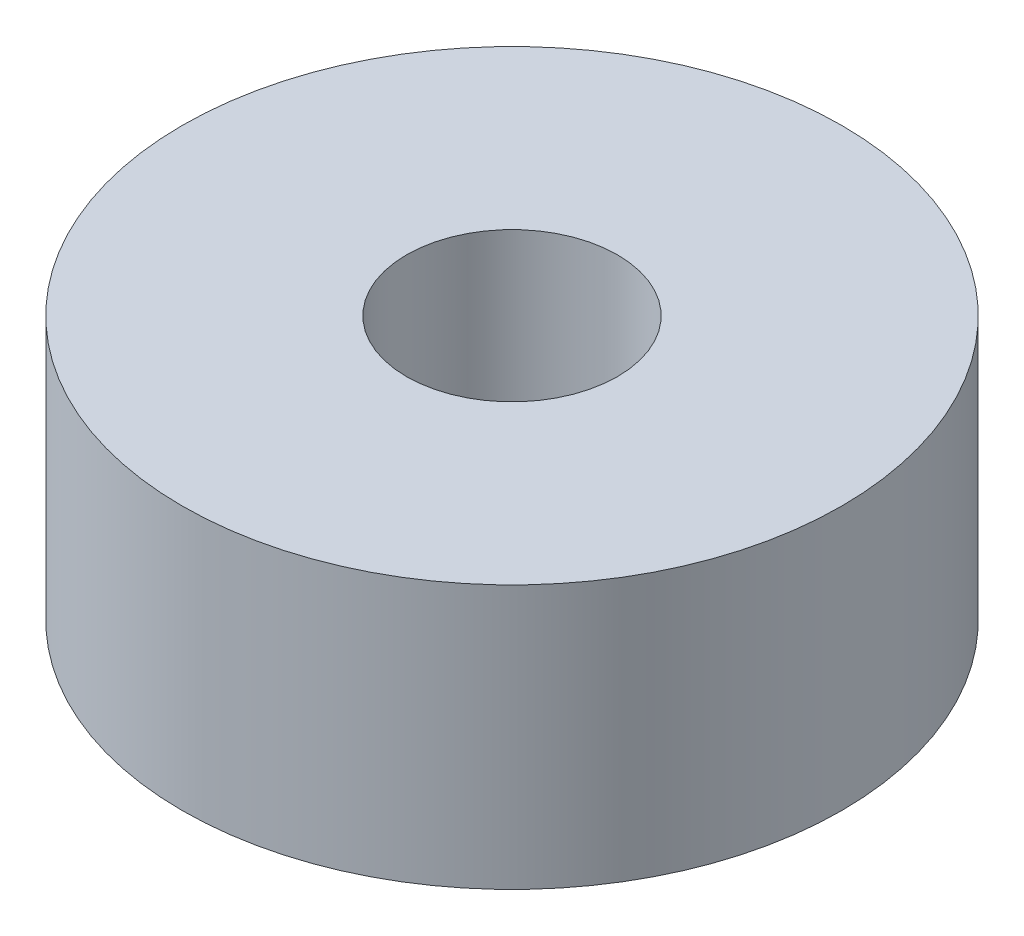
ISO-10303-21;
HEADER;
FILE_DESCRIPTION(('STEP AP214'),'2;1');
FILE_NAME('part.step','',(''),(''),'','','');
FILE_SCHEMA(('AUTOMOTIVE_DESIGN { 1 0 10303 214 1 1 1 1 }'));
ENDSEC;
DATA;
#1=APPLICATION_CONTEXT('core data for automotive mechanical design processes');
#2=APPLICATION_PROTOCOL_DEFINITION('international standard','automotive_design',2000,#1);
#3=PRODUCT_CONTEXT('',#1,'mechanical');
#4=PRODUCT('Part','Part','',(#3));
#5=PRODUCT_RELATED_PRODUCT_CATEGORY('part','',(#4));
#6=PRODUCT_DEFINITION_FORMATION('','',#4);
#7=PRODUCT_DEFINITION_CONTEXT('part definition',#1,'design');
#8=PRODUCT_DEFINITION('design','',#6,#7);
#9=PRODUCT_DEFINITION_SHAPE('','',#8);
#10=(LENGTH_UNIT() NAMED_UNIT(*) SI_UNIT(.MILLI.,.METRE.));
#11=(NAMED_UNIT(*) PLANE_ANGLE_UNIT() SI_UNIT($,.RADIAN.));
#12=(NAMED_UNIT(*) SI_UNIT($,.STERADIAN.) SOLID_ANGLE_UNIT());
#13=UNCERTAINTY_MEASURE_WITH_UNIT(LENGTH_MEASURE(1.E-05),#10,'distance_accuracy_value','');
#14=(GEOMETRIC_REPRESENTATION_CONTEXT(3) GLOBAL_UNCERTAINTY_ASSIGNED_CONTEXT((#13)) GLOBAL_UNIT_ASSIGNED_CONTEXT((#10,
#11,#12)) REPRESENTATION_CONTEXT('',''));
#15=CARTESIAN_POINT('',(0.,0.,0.));
#16=DIRECTION('',(0.,0.,1.));
#17=DIRECTION('',(1.,0.,0.));
#18=AXIS2_PLACEMENT_3D('',#15,#16,#17);
#19=CARTESIAN_POINT('',(0.,2.,0.));
#20=DIRECTION('',(0.,-1.,0.));
#21=DIRECTION('',(0.,0.,-1.));
#22=AXIS2_PLACEMENT_3D('',#19,#20,#21);
#23=CYLINDRICAL_SURFACE('',#22,2.5);
#24=CARTESIAN_POINT('',(0.,2.,0.));
#25=DIRECTION('',(0.,1.,0.));
#26=DIRECTION('',(0.,0.,1.));
#27=AXIS2_PLACEMENT_3D('',#24,#25,#26);
#28=CIRCLE('',#27,2.5);
#29=CARTESIAN_POINT('',(0.,2.,2.5));
#30=VERTEX_POINT('',#29);
#31=EDGE_CURVE('E10',#30,#30,#28,.T.);
#32=ORIENTED_EDGE('',*,*,#31,.F.);
#33=EDGE_LOOP('',(#32));
#34=FACE_BOUND('',#33,.T.);
#35=CARTESIAN_POINT('',(0.,0.,0.));
#36=DIRECTION('',(0.,1.,0.));
#37=DIRECTION('',(0.,0.,1.));
#38=AXIS2_PLACEMENT_3D('',#35,#36,#37);
#39=CIRCLE('',#38,2.5);
#40=CARTESIAN_POINT('',(0.,0.,2.5));
#41=VERTEX_POINT('',#40);
#42=EDGE_CURVE('E40',#41,#41,#39,.T.);
#43=ORIENTED_EDGE('',*,*,#42,.T.);
#44=EDGE_LOOP('',(#43));
#45=FACE_BOUND('',#44,.T.);
#46=ADVANCED_FACE('F37',(#34,#45),#23,.T.);
#47=CARTESIAN_POINT('',(0.,2.,0.));
#48=DIRECTION('',(0.,1.,0.));
#49=DIRECTION('',(0.,0.,1.));
#50=AXIS2_PLACEMENT_3D('',#47,#48,#49);
#51=PLANE('',#50);
#52=CARTESIAN_POINT('',(0.,2.,0.));
#53=DIRECTION('',(0.,1.,0.));
#54=DIRECTION('',(0.,0.,1.));
#55=AXIS2_PLACEMENT_3D('',#52,#53,#54);
#56=CIRCLE('',#55,0.8);
#57=CARTESIAN_POINT('',(0.,2.,0.8));
#58=VERTEX_POINT('',#57);
#59=EDGE_CURVE('E51',#58,#58,#56,.T.);
#60=ORIENTED_EDGE('',*,*,#59,.F.);
#61=EDGE_LOOP('',(#60));
#62=FACE_BOUND('',#61,.T.);
#63=ORIENTED_EDGE('',*,*,#31,.T.);
#64=EDGE_LOOP('',(#63));
#65=FACE_BOUND('',#64,.T.);
#66=ADVANCED_FACE('F68',(#62,#65),#51,.T.);
#67=CARTESIAN_POINT('',(0.,0.,0.));
#68=DIRECTION('',(0.,1.,0.));
#69=DIRECTION('',(0.,0.,1.));
#70=AXIS2_PLACEMENT_3D('',#67,#68,#69);
#71=PLANE('',#70);
#72=CARTESIAN_POINT('',(0.,0.,0.));
#73=DIRECTION('',(0.,1.,0.));
#74=DIRECTION('',(0.,0.,1.));
#75=AXIS2_PLACEMENT_3D('',#72,#73,#74);
#76=CIRCLE('',#75,0.8);
#77=CARTESIAN_POINT('',(0.,0.,0.8));
#78=VERTEX_POINT('',#77);
#79=EDGE_CURVE('E49',#78,#78,#76,.T.);
#80=ORIENTED_EDGE('',*,*,#79,.T.);
#81=EDGE_LOOP('',(#80));
#82=FACE_BOUND('',#81,.T.);
#83=ORIENTED_EDGE('',*,*,#42,.F.);
#84=EDGE_LOOP('',(#83));
#85=FACE_BOUND('',#84,.T.);
#86=ADVANCED_FACE('F59',(#82,#85),#71,.F.);
#87=CARTESIAN_POINT('',(0.,0.,0.));
#88=DIRECTION('',(0.,1.,0.));
#89=DIRECTION('',(0.,0.,1.));
#90=AXIS2_PLACEMENT_3D('',#87,#88,#89);
#91=CYLINDRICAL_SURFACE('',#90,0.8);
#92=ORIENTED_EDGE('',*,*,#79,.F.);
#93=EDGE_LOOP('',(#92));
#94=FACE_BOUND('',#93,.T.);
#95=ORIENTED_EDGE('',*,*,#59,.T.);
#96=EDGE_LOOP('',(#95));
#97=FACE_BOUND('',#96,.T.);
#98=ADVANCED_FACE('F62',(#94,#97),#91,.F.);
#99=CLOSED_SHELL('',(#46,#66,#86,#98));
#100=MANIFOLD_SOLID_BREP('B2',#99);
#101=ADVANCED_BREP_SHAPE_REPRESENTATION('',(#18,#100),#14);
#102=SHAPE_DEFINITION_REPRESENTATION(#9,#101);
ENDSEC;
END-ISO-10303-21;
